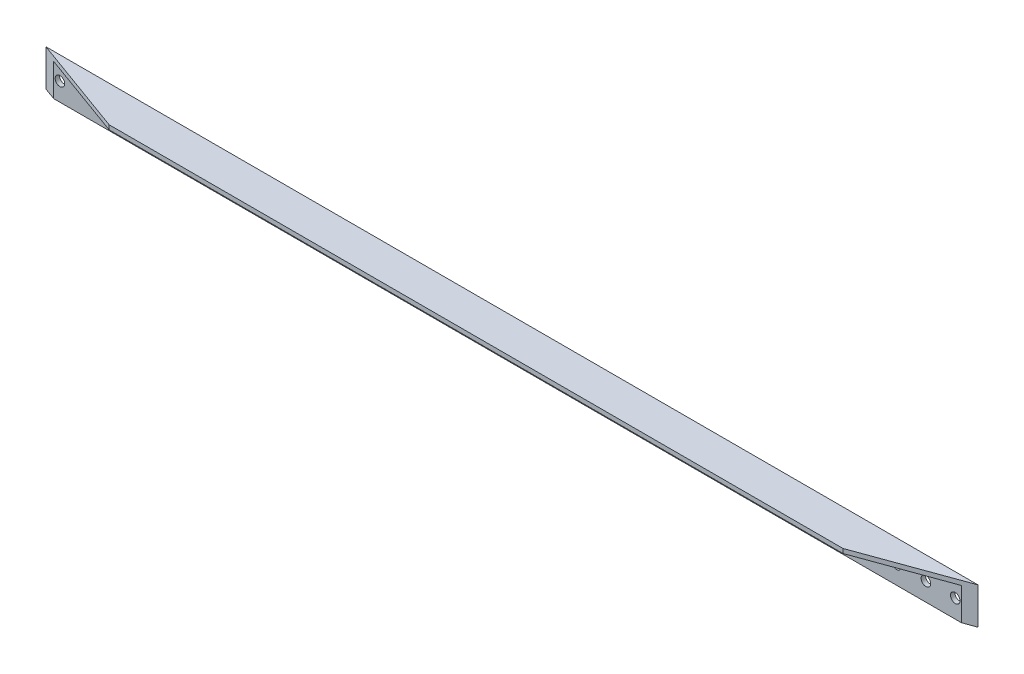
ISO-10303-21;
HEADER;
FILE_DESCRIPTION(('STEP AP214'),'2;1');
FILE_NAME('part.step','',(''),(''),'','','');
FILE_SCHEMA(('AUTOMOTIVE_DESIGN { 1 0 10303 214 1 1 1 1 }'));
ENDSEC;
DATA;
#1=APPLICATION_CONTEXT('core data for automotive mechanical design processes');
#2=APPLICATION_PROTOCOL_DEFINITION('international standard','automotive_design',2000,#1);
#3=PRODUCT_CONTEXT('',#1,'mechanical');
#4=PRODUCT('Part','Part','',(#3));
#5=PRODUCT_RELATED_PRODUCT_CATEGORY('part','',(#4));
#6=PRODUCT_DEFINITION_FORMATION('','',#4);
#7=PRODUCT_DEFINITION_CONTEXT('part definition',#1,'design');
#8=PRODUCT_DEFINITION('design','',#6,#7);
#9=PRODUCT_DEFINITION_SHAPE('','',#8);
#10=(LENGTH_UNIT() NAMED_UNIT(*) SI_UNIT(.MILLI.,.METRE.));
#11=(NAMED_UNIT(*) PLANE_ANGLE_UNIT() SI_UNIT($,.RADIAN.));
#12=(NAMED_UNIT(*) SI_UNIT($,.STERADIAN.) SOLID_ANGLE_UNIT());
#13=UNCERTAINTY_MEASURE_WITH_UNIT(LENGTH_MEASURE(1.E-05),#10,'distance_accuracy_value','');
#14=(GEOMETRIC_REPRESENTATION_CONTEXT(3) GLOBAL_UNCERTAINTY_ASSIGNED_CONTEXT((#13)) GLOBAL_UNIT_ASSIGNED_CONTEXT((#10,
#11,#12)) REPRESENTATION_CONTEXT('',''));
#15=CARTESIAN_POINT('',(0.,0.,0.));
#16=DIRECTION('',(0.,0.,1.));
#17=DIRECTION('',(1.,0.,0.));
#18=AXIS2_PLACEMENT_3D('',#15,#16,#17);
#19=CARTESIAN_POINT('',(-1270.,-50.,12.));
#20=DIRECTION('',(0.,0.,1.));
#21=DIRECTION('',(1.,0.,0.));
#22=AXIS2_PLACEMENT_3D('',#19,#20,#21);
#23=PLANE('',#22);
#24=DIRECTION('',(0.,1.,0.));
#25=VECTOR('',#24,1.);
#26=CARTESIAN_POINT('',(-1236.9387755102,-50.,12.));
#27=LINE('',#26,#25);
#28=CARTESIAN_POINT('',(-1236.9387755102,-50.,12.));
#29=VERTEX_POINT('',#28);
#30=CARTESIAN_POINT('',(-1236.9387755102,38.,12.));
#31=VERTEX_POINT('',#30);
#32=EDGE_CURVE('E239',#29,#31,#27,.T.);
#33=ORIENTED_EDGE('',*,*,#32,.F.);
#34=DIRECTION('',(1.,0.,0.));
#35=VECTOR('',#34,1.);
#36=CARTESIAN_POINT('',(-1270.,-50.,12.));
#37=LINE('',#36,#35);
#38=CARTESIAN_POINT('',(1236.9387755102,-50.,11.9999999999999));
#39=VERTEX_POINT('',#38);
#40=EDGE_CURVE('E103',#29,#39,#37,.T.);
#41=ORIENTED_EDGE('',*,*,#40,.T.);
#42=DIRECTION('',(0.,-1.,0.));
#43=VECTOR('',#42,1.);
#44=CARTESIAN_POINT('',(1236.9387755102,-50.,12.));
#45=LINE('',#44,#43);
#46=CARTESIAN_POINT('',(1236.9387755102,38.,12.));
#47=VERTEX_POINT('',#46);
#48=EDGE_CURVE('E230',#47,#39,#45,.T.);
#49=ORIENTED_EDGE('',*,*,#48,.F.);
#50=DIRECTION('',(1.,0.,0.));
#51=VECTOR('',#50,1.);
#52=CARTESIAN_POINT('',(-1270.,38.,12.));
#53=LINE('',#52,#51);
#54=EDGE_CURVE('E227',#31,#47,#53,.T.);
#55=ORIENTED_EDGE('',*,*,#54,.F.);
#56=EDGE_LOOP('',(#33,#41,#49,#55));
#57=FACE_BOUND('',#56,.T.);
#58=CARTESIAN_POINT('',(-1140.,0.,12.));
#59=DIRECTION('',(0.,0.,1.));
#60=DIRECTION('',(-1.,0.,0.));
#61=AXIS2_PLACEMENT_3D('',#58,#59,#60);
#62=CIRCLE('',#61,12.9999999999998);
#63=CARTESIAN_POINT('',(-1153.,0.,12.));
#64=VERTEX_POINT('',#63);
#65=EDGE_CURVE('E212',#64,#64,#62,.T.);
#66=ORIENTED_EDGE('',*,*,#65,.F.);
#67=EDGE_LOOP('',(#66));
#68=FACE_BOUND('',#67,.T.);
#69=CARTESIAN_POINT('',(-979.999999999999,0.,12.));
#70=DIRECTION('',(0.,0.,1.));
#71=DIRECTION('',(-1.,0.,0.));
#72=AXIS2_PLACEMENT_3D('',#69,#70,#71);
#73=CIRCLE('',#72,13.);
#74=CARTESIAN_POINT('',(-992.999999999999,0.,12.));
#75=VERTEX_POINT('',#74);
#76=EDGE_CURVE('E200',#75,#75,#73,.T.);
#77=ORIENTED_EDGE('',*,*,#76,.F.);
#78=EDGE_LOOP('',(#77));
#79=FACE_BOUND('',#78,.T.);
#80=CARTESIAN_POINT('',(-459.999999999999,0.,12.));
#81=DIRECTION('',(0.,0.,1.));
#82=DIRECTION('',(-1.,0.,0.));
#83=AXIS2_PLACEMENT_3D('',#80,#81,#82);
#84=CIRCLE('',#83,13.);
#85=CARTESIAN_POINT('',(-472.999999999999,0.,12.));
#86=VERTEX_POINT('',#85);
#87=EDGE_CURVE('E188',#86,#86,#84,.T.);
#88=ORIENTED_EDGE('',*,*,#87,.F.);
#89=EDGE_LOOP('',(#88));
#90=FACE_BOUND('',#89,.T.);
#91=CARTESIAN_POINT('',(-299.999999999999,0.,12.));
#92=DIRECTION('',(0.,0.,1.));
#93=DIRECTION('',(-1.,0.,0.));
#94=AXIS2_PLACEMENT_3D('',#91,#92,#93);
#95=CIRCLE('',#94,13.);
#96=CARTESIAN_POINT('',(-312.999999999999,0.,12.));
#97=VERTEX_POINT('',#96);
#98=EDGE_CURVE('E176',#97,#97,#95,.T.);
#99=ORIENTED_EDGE('',*,*,#98,.F.);
#100=EDGE_LOOP('',(#99));
#101=FACE_BOUND('',#100,.T.);
#102=CARTESIAN_POINT('',(179.999999999999,0.,12.));
#103=DIRECTION('',(0.,0.,1.));
#104=DIRECTION('',(1.,0.,0.));
#105=AXIS2_PLACEMENT_3D('',#102,#103,#104);
#106=CIRCLE('',#105,13.);
#107=CARTESIAN_POINT('',(192.999999999999,0.,12.));
#108=VERTEX_POINT('',#107);
#109=EDGE_CURVE('E164',#108,#108,#106,.T.);
#110=ORIENTED_EDGE('',*,*,#109,.F.);
#111=EDGE_LOOP('',(#110));
#112=FACE_BOUND('',#111,.T.);
#113=CARTESIAN_POINT('',(379.999999999999,0.,12.));
#114=DIRECTION('',(0.,0.,1.));
#115=DIRECTION('',(1.,0.,0.));
#116=AXIS2_PLACEMENT_3D('',#113,#114,#115);
#117=CIRCLE('',#116,13.);
#118=CARTESIAN_POINT('',(392.999999999999,0.,12.));
#119=VERTEX_POINT('',#118);
#120=EDGE_CURVE('E152',#119,#119,#117,.T.);
#121=ORIENTED_EDGE('',*,*,#120,.F.);
#122=EDGE_LOOP('',(#121));
#123=FACE_BOUND('',#122,.T.);
#124=CARTESIAN_POINT('',(579.999999999999,0.,12.));
#125=DIRECTION('',(0.,0.,1.));
#126=DIRECTION('',(1.,0.,0.));
#127=AXIS2_PLACEMENT_3D('',#124,#125,#126);
#128=CIRCLE('',#127,13.);
#129=CARTESIAN_POINT('',(592.999999999999,0.,12.));
#130=VERTEX_POINT('',#129);
#131=EDGE_CURVE('E140',#130,#130,#128,.T.);
#132=ORIENTED_EDGE('',*,*,#131,.F.);
#133=EDGE_LOOP('',(#132));
#134=FACE_BOUND('',#133,.T.);
#135=CARTESIAN_POINT('',(1060.,0.,12.));
#136=DIRECTION('',(0.,0.,1.));
#137=DIRECTION('',(1.,0.,0.));
#138=AXIS2_PLACEMENT_3D('',#135,#136,#137);
#139=CIRCLE('',#138,12.9999999999998);
#140=CARTESIAN_POINT('',(1073.,0.,12.));
#141=VERTEX_POINT('',#140);
#142=EDGE_CURVE('E128',#141,#141,#139,.T.);
#143=ORIENTED_EDGE('',*,*,#142,.F.);
#144=EDGE_LOOP('',(#143));
#145=FACE_BOUND('',#144,.T.);
#146=CARTESIAN_POINT('',(1220.,0.,12.));
#147=DIRECTION('',(0.,0.,1.));
#148=DIRECTION('',(1.,0.,0.));
#149=AXIS2_PLACEMENT_3D('',#146,#147,#148);
#150=CIRCLE('',#149,12.9999999999998);
#151=CARTESIAN_POINT('',(1233.,0.,12.));
#152=VERTEX_POINT('',#151);
#153=EDGE_CURVE('E96',#152,#152,#150,.T.);
#154=ORIENTED_EDGE('',*,*,#153,.F.);
#155=EDGE_LOOP('',(#154));
#156=FACE_BOUND('',#155,.T.);
#157=CARTESIAN_POINT('',(1140.,0.,12.));
#158=DIRECTION('',(0.,0.,1.));
#159=DIRECTION('',(1.,0.,0.));
#160=AXIS2_PLACEMENT_3D('',#157,#158,#159);
#161=CIRCLE('',#160,12.9999999999998);
#162=CARTESIAN_POINT('',(1153.,0.,12.));
#163=VERTEX_POINT('',#162);
#164=EDGE_CURVE('E122',#163,#163,#161,.T.);
#165=ORIENTED_EDGE('',*,*,#164,.F.);
#166=EDGE_LOOP('',(#165));
#167=FACE_BOUND('',#166,.T.);
#168=CARTESIAN_POINT('',(979.999999999999,0.,12.));
#169=DIRECTION('',(0.,0.,1.));
#170=DIRECTION('',(1.,0.,0.));
#171=AXIS2_PLACEMENT_3D('',#168,#169,#170);
#172=CIRCLE('',#171,13.);
#173=CARTESIAN_POINT('',(992.999999999999,0.,12.));
#174=VERTEX_POINT('',#173);
#175=EDGE_CURVE('E134',#174,#174,#172,.T.);
#176=ORIENTED_EDGE('',*,*,#175,.F.);
#177=EDGE_LOOP('',(#176));
#178=FACE_BOUND('',#177,.T.);
#179=CARTESIAN_POINT('',(459.999999999999,0.,12.));
#180=DIRECTION('',(0.,0.,1.));
#181=DIRECTION('',(1.,0.,0.));
#182=AXIS2_PLACEMENT_3D('',#179,#180,#181);
#183=CIRCLE('',#182,13.);
#184=CARTESIAN_POINT('',(472.999999999999,0.,12.));
#185=VERTEX_POINT('',#184);
#186=EDGE_CURVE('E146',#185,#185,#183,.T.);
#187=ORIENTED_EDGE('',*,*,#186,.F.);
#188=EDGE_LOOP('',(#187));
#189=FACE_BOUND('',#188,.T.);
#190=CARTESIAN_POINT('',(299.999999999999,0.,12.));
#191=DIRECTION('',(0.,0.,1.));
#192=DIRECTION('',(1.,0.,0.));
#193=AXIS2_PLACEMENT_3D('',#190,#191,#192);
#194=CIRCLE('',#193,13.);
#195=CARTESIAN_POINT('',(312.999999999999,0.,12.));
#196=VERTEX_POINT('',#195);
#197=EDGE_CURVE('E158',#196,#196,#194,.T.);
#198=ORIENTED_EDGE('',*,*,#197,.F.);
#199=EDGE_LOOP('',(#198));
#200=FACE_BOUND('',#199,.T.);
#201=CARTESIAN_POINT('',(-179.999999999999,0.,12.));
#202=DIRECTION('',(0.,0.,1.));
#203=DIRECTION('',(-1.,0.,0.));
#204=AXIS2_PLACEMENT_3D('',#201,#202,#203);
#205=CIRCLE('',#204,13.);
#206=CARTESIAN_POINT('',(-192.999999999999,0.,12.));
#207=VERTEX_POINT('',#206);
#208=EDGE_CURVE('E170',#207,#207,#205,.T.);
#209=ORIENTED_EDGE('',*,*,#208,.F.);
#210=EDGE_LOOP('',(#209));
#211=FACE_BOUND('',#210,.T.);
#212=CARTESIAN_POINT('',(-379.999999999999,0.,12.));
#213=DIRECTION('',(0.,0.,1.));
#214=DIRECTION('',(-1.,0.,0.));
#215=AXIS2_PLACEMENT_3D('',#212,#213,#214);
#216=CIRCLE('',#215,13.);
#217=CARTESIAN_POINT('',(-392.999999999999,0.,12.));
#218=VERTEX_POINT('',#217);
#219=EDGE_CURVE('E182',#218,#218,#216,.T.);
#220=ORIENTED_EDGE('',*,*,#219,.F.);
#221=EDGE_LOOP('',(#220));
#222=FACE_BOUND('',#221,.T.);
#223=CARTESIAN_POINT('',(-579.999999999999,0.,12.));
#224=DIRECTION('',(0.,0.,1.));
#225=DIRECTION('',(-1.,0.,0.));
#226=AXIS2_PLACEMENT_3D('',#223,#224,#225);
#227=CIRCLE('',#226,13.);
#228=CARTESIAN_POINT('',(-592.999999999999,0.,12.));
#229=VERTEX_POINT('',#228);
#230=EDGE_CURVE('E194',#229,#229,#227,.T.);
#231=ORIENTED_EDGE('',*,*,#230,.F.);
#232=EDGE_LOOP('',(#231));
#233=FACE_BOUND('',#232,.T.);
#234=CARTESIAN_POINT('',(-1060.,0.,12.));
#235=DIRECTION('',(0.,0.,1.));
#236=DIRECTION('',(-1.,0.,0.));
#237=AXIS2_PLACEMENT_3D('',#234,#235,#236);
#238=CIRCLE('',#237,12.9999999999998);
#239=CARTESIAN_POINT('',(-1073.,0.,12.));
#240=VERTEX_POINT('',#239);
#241=EDGE_CURVE('E206',#240,#240,#238,.T.);
#242=ORIENTED_EDGE('',*,*,#241,.F.);
#243=EDGE_LOOP('',(#242));
#244=FACE_BOUND('',#243,.T.);
#245=CARTESIAN_POINT('',(-1220.,0.,12.));
#246=DIRECTION('',(0.,0.,1.));
#247=DIRECTION('',(-1.,0.,0.));
#248=AXIS2_PLACEMENT_3D('',#245,#246,#247);
#249=CIRCLE('',#248,12.9999999999998);
#250=CARTESIAN_POINT('',(-1233.,0.,12.));
#251=VERTEX_POINT('',#250);
#252=EDGE_CURVE('E218',#251,#251,#249,.T.);
#253=ORIENTED_EDGE('',*,*,#252,.F.);
#254=EDGE_LOOP('',(#253));
#255=FACE_BOUND('',#254,.T.);
#256=ADVANCED_FACE('F33',(#57,#68,#79,#90,#101,#112,#123,#134,#145,#156,#167,#178,#189,#200,
#211,#222,#233,#244,#255),#23,.T.);
#257=CARTESIAN_POINT('',(-1270.,-50.,0.));
#258=DIRECTION('',(0.,0.,1.));
#259=DIRECTION('',(1.,0.,0.));
#260=AXIS2_PLACEMENT_3D('',#257,#258,#259);
#261=PLANE('',#260);
#262=DIRECTION('',(0.,-1.,0.));
#263=VECTOR('',#262,1.);
#264=CARTESIAN_POINT('',(-1270.,50.,0.));
#265=LINE('',#264,#263);
#266=CARTESIAN_POINT('',(-1270.,50.,0.));
#267=VERTEX_POINT('',#266);
#268=CARTESIAN_POINT('',(-1270.,-50.,0.));
#269=VERTEX_POINT('',#268);
#270=EDGE_CURVE('E84',#267,#269,#265,.T.);
#271=ORIENTED_EDGE('',*,*,#270,.F.);
#272=DIRECTION('',(-1.,0.,0.));
#273=VECTOR('',#272,1.);
#274=CARTESIAN_POINT('',(-1270.,50.,0.));
#275=LINE('',#274,#273);
#276=CARTESIAN_POINT('',(1270.,50.,0.));
#277=VERTEX_POINT('',#276);
#278=EDGE_CURVE('E109',#277,#267,#275,.T.);
#279=ORIENTED_EDGE('',*,*,#278,.F.);
#280=DIRECTION('',(0.,1.,0.));
#281=VECTOR('',#280,1.);
#282=CARTESIAN_POINT('',(1270.,50.,0.));
#283=LINE('',#282,#281);
#284=CARTESIAN_POINT('',(1270.,-50.,0.));
#285=VERTEX_POINT('',#284);
#286=EDGE_CURVE('E107',#285,#277,#283,.T.);
#287=ORIENTED_EDGE('',*,*,#286,.F.);
#288=DIRECTION('',(1.,0.,0.));
#289=VECTOR('',#288,1.);
#290=CARTESIAN_POINT('',(-1270.,-50.,0.));
#291=LINE('',#290,#289);
#292=EDGE_CURVE('E95',#269,#285,#291,.T.);
#293=ORIENTED_EDGE('',*,*,#292,.F.);
#294=EDGE_LOOP('',(#271,#279,#287,#293));
#295=FACE_BOUND('',#294,.T.);
#296=CARTESIAN_POINT('',(1220.,0.,0.));
#297=DIRECTION('',(0.,0.,1.));
#298=DIRECTION('',(1.,0.,0.));
#299=AXIS2_PLACEMENT_3D('',#296,#297,#298);
#300=CIRCLE('',#299,12.9999999999998);
#301=CARTESIAN_POINT('',(1233.,0.,0.));
#302=VERTEX_POINT('',#301);
#303=EDGE_CURVE('E119',#302,#302,#300,.T.);
#304=ORIENTED_EDGE('',*,*,#303,.T.);
#305=EDGE_LOOP('',(#304));
#306=FACE_BOUND('',#305,.T.);
#307=CARTESIAN_POINT('',(1140.,0.,0.));
#308=DIRECTION('',(0.,0.,1.));
#309=DIRECTION('',(1.,0.,0.));
#310=AXIS2_PLACEMENT_3D('',#307,#308,#309);
#311=CIRCLE('',#310,12.9999999999998);
#312=CARTESIAN_POINT('',(1153.,0.,0.));
#313=VERTEX_POINT('',#312);
#314=EDGE_CURVE('E125',#313,#313,#311,.T.);
#315=ORIENTED_EDGE('',*,*,#314,.T.);
#316=EDGE_LOOP('',(#315));
#317=FACE_BOUND('',#316,.T.);
#318=CARTESIAN_POINT('',(1060.,0.,0.));
#319=DIRECTION('',(0.,0.,1.));
#320=DIRECTION('',(1.,0.,0.));
#321=AXIS2_PLACEMENT_3D('',#318,#319,#320);
#322=CIRCLE('',#321,12.9999999999998);
#323=CARTESIAN_POINT('',(1073.,0.,0.));
#324=VERTEX_POINT('',#323);
#325=EDGE_CURVE('E131',#324,#324,#322,.T.);
#326=ORIENTED_EDGE('',*,*,#325,.T.);
#327=EDGE_LOOP('',(#326));
#328=FACE_BOUND('',#327,.T.);
#329=CARTESIAN_POINT('',(979.999999999999,0.,0.));
#330=DIRECTION('',(0.,0.,1.));
#331=DIRECTION('',(1.,0.,0.));
#332=AXIS2_PLACEMENT_3D('',#329,#330,#331);
#333=CIRCLE('',#332,13.);
#334=CARTESIAN_POINT('',(992.999999999999,0.,0.));
#335=VERTEX_POINT('',#334);
#336=EDGE_CURVE('E137',#335,#335,#333,.T.);
#337=ORIENTED_EDGE('',*,*,#336,.T.);
#338=EDGE_LOOP('',(#337));
#339=FACE_BOUND('',#338,.T.);
#340=CARTESIAN_POINT('',(579.999999999999,0.,0.));
#341=DIRECTION('',(0.,0.,1.));
#342=DIRECTION('',(1.,0.,0.));
#343=AXIS2_PLACEMENT_3D('',#340,#341,#342);
#344=CIRCLE('',#343,13.);
#345=CARTESIAN_POINT('',(592.999999999999,0.,0.));
#346=VERTEX_POINT('',#345);
#347=EDGE_CURVE('E143',#346,#346,#344,.T.);
#348=ORIENTED_EDGE('',*,*,#347,.T.);
#349=EDGE_LOOP('',(#348));
#350=FACE_BOUND('',#349,.T.);
#351=CARTESIAN_POINT('',(459.999999999999,0.,0.));
#352=DIRECTION('',(0.,0.,1.));
#353=DIRECTION('',(1.,0.,0.));
#354=AXIS2_PLACEMENT_3D('',#351,#352,#353);
#355=CIRCLE('',#354,13.);
#356=CARTESIAN_POINT('',(472.999999999999,0.,0.));
#357=VERTEX_POINT('',#356);
#358=EDGE_CURVE('E149',#357,#357,#355,.T.);
#359=ORIENTED_EDGE('',*,*,#358,.T.);
#360=EDGE_LOOP('',(#359));
#361=FACE_BOUND('',#360,.T.);
#362=CARTESIAN_POINT('',(379.999999999999,0.,0.));
#363=DIRECTION('',(0.,0.,1.));
#364=DIRECTION('',(1.,0.,0.));
#365=AXIS2_PLACEMENT_3D('',#362,#363,#364);
#366=CIRCLE('',#365,13.);
#367=CARTESIAN_POINT('',(392.999999999999,0.,0.));
#368=VERTEX_POINT('',#367);
#369=EDGE_CURVE('E155',#368,#368,#366,.T.);
#370=ORIENTED_EDGE('',*,*,#369,.T.);
#371=EDGE_LOOP('',(#370));
#372=FACE_BOUND('',#371,.T.);
#373=CARTESIAN_POINT('',(299.999999999999,0.,0.));
#374=DIRECTION('',(0.,0.,1.));
#375=DIRECTION('',(1.,0.,0.));
#376=AXIS2_PLACEMENT_3D('',#373,#374,#375);
#377=CIRCLE('',#376,13.);
#378=CARTESIAN_POINT('',(312.999999999999,0.,0.));
#379=VERTEX_POINT('',#378);
#380=EDGE_CURVE('E161',#379,#379,#377,.T.);
#381=ORIENTED_EDGE('',*,*,#380,.T.);
#382=EDGE_LOOP('',(#381));
#383=FACE_BOUND('',#382,.T.);
#384=CARTESIAN_POINT('',(179.999999999999,0.,0.));
#385=DIRECTION('',(0.,0.,1.));
#386=DIRECTION('',(1.,0.,0.));
#387=AXIS2_PLACEMENT_3D('',#384,#385,#386);
#388=CIRCLE('',#387,13.);
#389=CARTESIAN_POINT('',(192.999999999999,0.,0.));
#390=VERTEX_POINT('',#389);
#391=EDGE_CURVE('E167',#390,#390,#388,.T.);
#392=ORIENTED_EDGE('',*,*,#391,.T.);
#393=EDGE_LOOP('',(#392));
#394=FACE_BOUND('',#393,.T.);
#395=CARTESIAN_POINT('',(-179.999999999999,0.,0.));
#396=DIRECTION('',(0.,0.,1.));
#397=DIRECTION('',(-1.,0.,0.));
#398=AXIS2_PLACEMENT_3D('',#395,#396,#397);
#399=CIRCLE('',#398,13.);
#400=CARTESIAN_POINT('',(-192.999999999999,0.,0.));
#401=VERTEX_POINT('',#400);
#402=EDGE_CURVE('E173',#401,#401,#399,.T.);
#403=ORIENTED_EDGE('',*,*,#402,.T.);
#404=EDGE_LOOP('',(#403));
#405=FACE_BOUND('',#404,.T.);
#406=CARTESIAN_POINT('',(-299.999999999999,0.,0.));
#407=DIRECTION('',(0.,0.,1.));
#408=DIRECTION('',(-1.,0.,0.));
#409=AXIS2_PLACEMENT_3D('',#406,#407,#408);
#410=CIRCLE('',#409,13.);
#411=CARTESIAN_POINT('',(-312.999999999999,0.,0.));
#412=VERTEX_POINT('',#411);
#413=EDGE_CURVE('E179',#412,#412,#410,.T.);
#414=ORIENTED_EDGE('',*,*,#413,.T.);
#415=EDGE_LOOP('',(#414));
#416=FACE_BOUND('',#415,.T.);
#417=CARTESIAN_POINT('',(-379.999999999999,0.,0.));
#418=DIRECTION('',(0.,0.,1.));
#419=DIRECTION('',(-1.,0.,0.));
#420=AXIS2_PLACEMENT_3D('',#417,#418,#419);
#421=CIRCLE('',#420,13.);
#422=CARTESIAN_POINT('',(-392.999999999999,0.,0.));
#423=VERTEX_POINT('',#422);
#424=EDGE_CURVE('E185',#423,#423,#421,.T.);
#425=ORIENTED_EDGE('',*,*,#424,.T.);
#426=EDGE_LOOP('',(#425));
#427=FACE_BOUND('',#426,.T.);
#428=CARTESIAN_POINT('',(-459.999999999999,0.,0.));
#429=DIRECTION('',(0.,0.,1.));
#430=DIRECTION('',(-1.,0.,0.));
#431=AXIS2_PLACEMENT_3D('',#428,#429,#430);
#432=CIRCLE('',#431,13.);
#433=CARTESIAN_POINT('',(-472.999999999999,0.,0.));
#434=VERTEX_POINT('',#433);
#435=EDGE_CURVE('E191',#434,#434,#432,.T.);
#436=ORIENTED_EDGE('',*,*,#435,.T.);
#437=EDGE_LOOP('',(#436));
#438=FACE_BOUND('',#437,.T.);
#439=CARTESIAN_POINT('',(-579.999999999999,0.,0.));
#440=DIRECTION('',(0.,0.,1.));
#441=DIRECTION('',(-1.,0.,0.));
#442=AXIS2_PLACEMENT_3D('',#439,#440,#441);
#443=CIRCLE('',#442,13.);
#444=CARTESIAN_POINT('',(-592.999999999999,0.,0.));
#445=VERTEX_POINT('',#444);
#446=EDGE_CURVE('E197',#445,#445,#443,.T.);
#447=ORIENTED_EDGE('',*,*,#446,.T.);
#448=EDGE_LOOP('',(#447));
#449=FACE_BOUND('',#448,.T.);
#450=CARTESIAN_POINT('',(-979.999999999999,0.,0.));
#451=DIRECTION('',(0.,0.,1.));
#452=DIRECTION('',(-1.,0.,0.));
#453=AXIS2_PLACEMENT_3D('',#450,#451,#452);
#454=CIRCLE('',#453,13.);
#455=CARTESIAN_POINT('',(-992.999999999999,0.,0.));
#456=VERTEX_POINT('',#455);
#457=EDGE_CURVE('E203',#456,#456,#454,.T.);
#458=ORIENTED_EDGE('',*,*,#457,.T.);
#459=EDGE_LOOP('',(#458));
#460=FACE_BOUND('',#459,.T.);
#461=CARTESIAN_POINT('',(-1060.,0.,0.));
#462=DIRECTION('',(0.,0.,1.));
#463=DIRECTION('',(-1.,0.,0.));
#464=AXIS2_PLACEMENT_3D('',#461,#462,#463);
#465=CIRCLE('',#464,12.9999999999998);
#466=CARTESIAN_POINT('',(-1073.,0.,0.));
#467=VERTEX_POINT('',#466);
#468=EDGE_CURVE('E209',#467,#467,#465,.T.);
#469=ORIENTED_EDGE('',*,*,#468,.T.);
#470=EDGE_LOOP('',(#469));
#471=FACE_BOUND('',#470,.T.);
#472=CARTESIAN_POINT('',(-1140.,0.,0.));
#473=DIRECTION('',(0.,0.,1.));
#474=DIRECTION('',(-1.,0.,0.));
#475=AXIS2_PLACEMENT_3D('',#472,#473,#474);
#476=CIRCLE('',#475,12.9999999999998);
#477=CARTESIAN_POINT('',(-1153.,0.,0.));
#478=VERTEX_POINT('',#477);
#479=EDGE_CURVE('E215',#478,#478,#476,.T.);
#480=ORIENTED_EDGE('',*,*,#479,.T.);
#481=EDGE_LOOP('',(#480));
#482=FACE_BOUND('',#481,.T.);
#483=CARTESIAN_POINT('',(-1220.,0.,0.));
#484=DIRECTION('',(0.,0.,1.));
#485=DIRECTION('',(-1.,0.,0.));
#486=AXIS2_PLACEMENT_3D('',#483,#484,#485);
#487=CIRCLE('',#486,12.9999999999998);
#488=CARTESIAN_POINT('',(-1233.,0.,0.));
#489=VERTEX_POINT('',#488);
#490=EDGE_CURVE('E221',#489,#489,#487,.T.);
#491=ORIENTED_EDGE('',*,*,#490,.T.);
#492=EDGE_LOOP('',(#491));
#493=FACE_BOUND('',#492,.T.);
#494=ADVANCED_FACE('F105',(#295,#306,#317,#328,#339,#350,#361,#372,#383,#394,#405,#416,#427,
#438,#449,#460,#471,#482,#493),#261,.F.);
#495=CARTESIAN_POINT('',(-1270.,-50.,12.));
#496=DIRECTION('',(0.,1.,0.));
#497=DIRECTION('',(0.,0.,1.));
#498=AXIS2_PLACEMENT_3D('',#495,#496,#497);
#499=PLANE('',#498);
#500=ORIENTED_EDGE('',*,*,#40,.F.);
#501=DIRECTION('',(-0.939996554641713,0.,-0.341183934647733));
#502=VECTOR('',#501,1.);
#503=CARTESIAN_POINT('',(-1270.,-50.,0.));
#504=LINE('',#503,#502);
#505=EDGE_CURVE('E87',#29,#269,#504,.T.);
#506=ORIENTED_EDGE('',*,*,#505,.T.);
#507=ORIENTED_EDGE('',*,*,#292,.T.);
#508=DIRECTION('',(-0.939996554641713,0.,0.341183934647733));
#509=VECTOR('',#508,1.);
#510=CARTESIAN_POINT('',(1270.,-50.,0.));
#511=LINE('',#510,#509);
#512=EDGE_CURVE('E237',#285,#39,#511,.T.);
#513=ORIENTED_EDGE('',*,*,#512,.T.);
#514=EDGE_LOOP('',(#500,#506,#507,#513));
#515=FACE_BOUND('',#514,.T.);
#516=ADVANCED_FACE('F35',(#515),#499,.F.);
#517=CARTESIAN_POINT('',(-1270.,50.,12.));
#518=DIRECTION('',(0.,-1.,0.));
#519=DIRECTION('',(0.,0.,-1.));
#520=AXIS2_PLACEMENT_3D('',#517,#518,#519);
#521=PLANE('',#520);
#522=ORIENTED_EDGE('',*,*,#278,.T.);
#523=DIRECTION('',(-0.939996554641713,0.,-0.341183934647733));
#524=VECTOR('',#523,1.);
#525=CARTESIAN_POINT('',(-1270.,50.,0.));
#526=LINE('',#525,#524);
#527=CARTESIAN_POINT('',(-1000.,50.,98.));
#528=VERTEX_POINT('',#527);
#529=EDGE_CURVE('E90',#528,#267,#526,.T.);
#530=ORIENTED_EDGE('',*,*,#529,.F.);
#531=DIRECTION('',(-1.,0.,0.));
#532=VECTOR('',#531,1.);
#533=CARTESIAN_POINT('',(-1270.,50.,98.));
#534=LINE('',#533,#532);
#535=CARTESIAN_POINT('',(999.999999999999,50.,98.));
#536=VERTEX_POINT('',#535);
#537=EDGE_CURVE('E224',#536,#528,#534,.T.);
#538=ORIENTED_EDGE('',*,*,#537,.F.);
#539=DIRECTION('',(-0.939996554641713,0.,0.341183934647733));
#540=VECTOR('',#539,1.);
#541=CARTESIAN_POINT('',(1270.,50.,0.));
#542=LINE('',#541,#540);
#543=EDGE_CURVE('E55',#277,#536,#542,.T.);
#544=ORIENTED_EDGE('',*,*,#543,.F.);
#545=EDGE_LOOP('',(#522,#530,#538,#544));
#546=FACE_BOUND('',#545,.T.);
#547=ADVANCED_FACE('F251',(#546),#521,.F.);
#548=CARTESIAN_POINT('',(1220.,0.,12.));
#549=DIRECTION('',(0.,0.,-1.));
#550=DIRECTION('',(-1.,0.,0.));
#551=AXIS2_PLACEMENT_3D('',#548,#549,#550);
#552=CYLINDRICAL_SURFACE('',#551,12.9999999999998);
#553=ORIENTED_EDGE('',*,*,#153,.T.);
#554=EDGE_LOOP('',(#553));
#555=FACE_BOUND('',#554,.T.);
#556=ORIENTED_EDGE('',*,*,#303,.F.);
#557=EDGE_LOOP('',(#556));
#558=FACE_BOUND('',#557,.T.);
#559=ADVANCED_FACE('F270',(#555,#558),#552,.F.);
#560=CARTESIAN_POINT('',(1140.,0.,12.));
#561=DIRECTION('',(0.,0.,-1.));
#562=DIRECTION('',(-1.,0.,0.));
#563=AXIS2_PLACEMENT_3D('',#560,#561,#562);
#564=CYLINDRICAL_SURFACE('',#563,12.9999999999998);
#565=ORIENTED_EDGE('',*,*,#164,.T.);
#566=EDGE_LOOP('',(#565));
#567=FACE_BOUND('',#566,.T.);
#568=ORIENTED_EDGE('',*,*,#314,.F.);
#569=EDGE_LOOP('',(#568));
#570=FACE_BOUND('',#569,.T.);
#571=ADVANCED_FACE('F277',(#567,#570),#564,.F.);
#572=CARTESIAN_POINT('',(1060.,0.,12.));
#573=DIRECTION('',(0.,0.,-1.));
#574=DIRECTION('',(-1.,0.,0.));
#575=AXIS2_PLACEMENT_3D('',#572,#573,#574);
#576=CYLINDRICAL_SURFACE('',#575,12.9999999999998);
#577=ORIENTED_EDGE('',*,*,#142,.T.);
#578=EDGE_LOOP('',(#577));
#579=FACE_BOUND('',#578,.T.);
#580=ORIENTED_EDGE('',*,*,#325,.F.);
#581=EDGE_LOOP('',(#580));
#582=FACE_BOUND('',#581,.T.);
#583=ADVANCED_FACE('F439',(#579,#582),#576,.F.);
#584=CARTESIAN_POINT('',(979.999999999999,0.,12.));
#585=DIRECTION('',(0.,0.,-1.));
#586=DIRECTION('',(-1.,0.,0.));
#587=AXIS2_PLACEMENT_3D('',#584,#585,#586);
#588=CYLINDRICAL_SURFACE('',#587,13.);
#589=ORIENTED_EDGE('',*,*,#175,.T.);
#590=EDGE_LOOP('',(#589));
#591=FACE_BOUND('',#590,.T.);
#592=ORIENTED_EDGE('',*,*,#336,.F.);
#593=EDGE_LOOP('',(#592));
#594=FACE_BOUND('',#593,.T.);
#595=ADVANCED_FACE('F429',(#591,#594),#588,.F.);
#596=CARTESIAN_POINT('',(579.999999999999,0.,12.));
#597=DIRECTION('',(0.,0.,-1.));
#598=DIRECTION('',(-1.,0.,0.));
#599=AXIS2_PLACEMENT_3D('',#596,#597,#598);
#600=CYLINDRICAL_SURFACE('',#599,13.);
#601=ORIENTED_EDGE('',*,*,#131,.T.);
#602=EDGE_LOOP('',(#601));
#603=FACE_BOUND('',#602,.T.);
#604=ORIENTED_EDGE('',*,*,#347,.F.);
#605=EDGE_LOOP('',(#604));
#606=FACE_BOUND('',#605,.T.);
#607=ADVANCED_FACE('F419',(#603,#606),#600,.F.);
#608=CARTESIAN_POINT('',(459.999999999999,0.,12.));
#609=DIRECTION('',(0.,0.,-1.));
#610=DIRECTION('',(-1.,0.,0.));
#611=AXIS2_PLACEMENT_3D('',#608,#609,#610);
#612=CYLINDRICAL_SURFACE('',#611,13.);
#613=ORIENTED_EDGE('',*,*,#186,.T.);
#614=EDGE_LOOP('',(#613));
#615=FACE_BOUND('',#614,.T.);
#616=ORIENTED_EDGE('',*,*,#358,.F.);
#617=EDGE_LOOP('',(#616));
#618=FACE_BOUND('',#617,.T.);
#619=ADVANCED_FACE('F409',(#615,#618),#612,.F.);
#620=CARTESIAN_POINT('',(379.999999999999,0.,12.));
#621=DIRECTION('',(0.,0.,-1.));
#622=DIRECTION('',(-1.,0.,0.));
#623=AXIS2_PLACEMENT_3D('',#620,#621,#622);
#624=CYLINDRICAL_SURFACE('',#623,13.);
#625=ORIENTED_EDGE('',*,*,#120,.T.);
#626=EDGE_LOOP('',(#625));
#627=FACE_BOUND('',#626,.T.);
#628=ORIENTED_EDGE('',*,*,#369,.F.);
#629=EDGE_LOOP('',(#628));
#630=FACE_BOUND('',#629,.T.);
#631=ADVANCED_FACE('F399',(#627,#630),#624,.F.);
#632=CARTESIAN_POINT('',(299.999999999999,0.,12.));
#633=DIRECTION('',(0.,0.,-1.));
#634=DIRECTION('',(-1.,0.,0.));
#635=AXIS2_PLACEMENT_3D('',#632,#633,#634);
#636=CYLINDRICAL_SURFACE('',#635,13.);
#637=ORIENTED_EDGE('',*,*,#197,.T.);
#638=EDGE_LOOP('',(#637));
#639=FACE_BOUND('',#638,.T.);
#640=ORIENTED_EDGE('',*,*,#380,.F.);
#641=EDGE_LOOP('',(#640));
#642=FACE_BOUND('',#641,.T.);
#643=ADVANCED_FACE('F389',(#639,#642),#636,.F.);
#644=CARTESIAN_POINT('',(179.999999999999,0.,12.));
#645=DIRECTION('',(0.,0.,-1.));
#646=DIRECTION('',(-1.,0.,0.));
#647=AXIS2_PLACEMENT_3D('',#644,#645,#646);
#648=CYLINDRICAL_SURFACE('',#647,13.);
#649=ORIENTED_EDGE('',*,*,#109,.T.);
#650=EDGE_LOOP('',(#649));
#651=FACE_BOUND('',#650,.T.);
#652=ORIENTED_EDGE('',*,*,#391,.F.);
#653=EDGE_LOOP('',(#652));
#654=FACE_BOUND('',#653,.T.);
#655=ADVANCED_FACE('F379',(#651,#654),#648,.F.);
#656=CARTESIAN_POINT('',(-179.999999999999,0.,12.));
#657=DIRECTION('',(0.,0.,-1.));
#658=DIRECTION('',(-1.,0.,0.));
#659=AXIS2_PLACEMENT_3D('',#656,#657,#658);
#660=CYLINDRICAL_SURFACE('',#659,13.);
#661=ORIENTED_EDGE('',*,*,#208,.T.);
#662=EDGE_LOOP('',(#661));
#663=FACE_BOUND('',#662,.T.);
#664=ORIENTED_EDGE('',*,*,#402,.F.);
#665=EDGE_LOOP('',(#664));
#666=FACE_BOUND('',#665,.T.);
#667=ADVANCED_FACE('F369',(#663,#666),#660,.F.);
#668=CARTESIAN_POINT('',(-299.999999999999,0.,12.));
#669=DIRECTION('',(0.,0.,-1.));
#670=DIRECTION('',(-1.,0.,0.));
#671=AXIS2_PLACEMENT_3D('',#668,#669,#670);
#672=CYLINDRICAL_SURFACE('',#671,13.);
#673=ORIENTED_EDGE('',*,*,#98,.T.);
#674=EDGE_LOOP('',(#673));
#675=FACE_BOUND('',#674,.T.);
#676=ORIENTED_EDGE('',*,*,#413,.F.);
#677=EDGE_LOOP('',(#676));
#678=FACE_BOUND('',#677,.T.);
#679=ADVANCED_FACE('F359',(#675,#678),#672,.F.);
#680=CARTESIAN_POINT('',(-379.999999999999,0.,12.));
#681=DIRECTION('',(0.,0.,-1.));
#682=DIRECTION('',(-1.,0.,0.));
#683=AXIS2_PLACEMENT_3D('',#680,#681,#682);
#684=CYLINDRICAL_SURFACE('',#683,13.);
#685=ORIENTED_EDGE('',*,*,#219,.T.);
#686=EDGE_LOOP('',(#685));
#687=FACE_BOUND('',#686,.T.);
#688=ORIENTED_EDGE('',*,*,#424,.F.);
#689=EDGE_LOOP('',(#688));
#690=FACE_BOUND('',#689,.T.);
#691=ADVANCED_FACE('F349',(#687,#690),#684,.F.);
#692=CARTESIAN_POINT('',(-459.999999999999,0.,12.));
#693=DIRECTION('',(0.,0.,-1.));
#694=DIRECTION('',(-1.,0.,0.));
#695=AXIS2_PLACEMENT_3D('',#692,#693,#694);
#696=CYLINDRICAL_SURFACE('',#695,13.);
#697=ORIENTED_EDGE('',*,*,#87,.T.);
#698=EDGE_LOOP('',(#697));
#699=FACE_BOUND('',#698,.T.);
#700=ORIENTED_EDGE('',*,*,#435,.F.);
#701=EDGE_LOOP('',(#700));
#702=FACE_BOUND('',#701,.T.);
#703=ADVANCED_FACE('F339',(#699,#702),#696,.F.);
#704=CARTESIAN_POINT('',(-579.999999999999,0.,12.));
#705=DIRECTION('',(0.,0.,-1.));
#706=DIRECTION('',(-1.,0.,0.));
#707=AXIS2_PLACEMENT_3D('',#704,#705,#706);
#708=CYLINDRICAL_SURFACE('',#707,13.);
#709=ORIENTED_EDGE('',*,*,#230,.T.);
#710=EDGE_LOOP('',(#709));
#711=FACE_BOUND('',#710,.T.);
#712=ORIENTED_EDGE('',*,*,#446,.F.);
#713=EDGE_LOOP('',(#712));
#714=FACE_BOUND('',#713,.T.);
#715=ADVANCED_FACE('F329',(#711,#714),#708,.F.);
#716=CARTESIAN_POINT('',(-979.999999999999,0.,12.));
#717=DIRECTION('',(0.,0.,-1.));
#718=DIRECTION('',(-1.,0.,0.));
#719=AXIS2_PLACEMENT_3D('',#716,#717,#718);
#720=CYLINDRICAL_SURFACE('',#719,13.);
#721=ORIENTED_EDGE('',*,*,#76,.T.);
#722=EDGE_LOOP('',(#721));
#723=FACE_BOUND('',#722,.T.);
#724=ORIENTED_EDGE('',*,*,#457,.F.);
#725=EDGE_LOOP('',(#724));
#726=FACE_BOUND('',#725,.T.);
#727=ADVANCED_FACE('F319',(#723,#726),#720,.F.);
#728=CARTESIAN_POINT('',(-1060.,0.,12.));
#729=DIRECTION('',(0.,0.,-1.));
#730=DIRECTION('',(-1.,0.,0.));
#731=AXIS2_PLACEMENT_3D('',#728,#729,#730);
#732=CYLINDRICAL_SURFACE('',#731,12.9999999999998);
#733=ORIENTED_EDGE('',*,*,#241,.T.);
#734=EDGE_LOOP('',(#733));
#735=FACE_BOUND('',#734,.T.);
#736=ORIENTED_EDGE('',*,*,#468,.F.);
#737=EDGE_LOOP('',(#736));
#738=FACE_BOUND('',#737,.T.);
#739=ADVANCED_FACE('F309',(#735,#738),#732,.F.);
#740=CARTESIAN_POINT('',(-1140.,0.,12.));
#741=DIRECTION('',(0.,0.,-1.));
#742=DIRECTION('',(-1.,0.,0.));
#743=AXIS2_PLACEMENT_3D('',#740,#741,#742);
#744=CYLINDRICAL_SURFACE('',#743,12.9999999999998);
#745=ORIENTED_EDGE('',*,*,#65,.T.);
#746=EDGE_LOOP('',(#745));
#747=FACE_BOUND('',#746,.T.);
#748=ORIENTED_EDGE('',*,*,#479,.F.);
#749=EDGE_LOOP('',(#748));
#750=FACE_BOUND('',#749,.T.);
#751=ADVANCED_FACE('F298',(#747,#750),#744,.F.);
#752=CARTESIAN_POINT('',(-1220.,0.,12.));
#753=DIRECTION('',(0.,0.,-1.));
#754=DIRECTION('',(-1.,0.,0.));
#755=AXIS2_PLACEMENT_3D('',#752,#753,#754);
#756=CYLINDRICAL_SURFACE('',#755,12.9999999999998);
#757=ORIENTED_EDGE('',*,*,#252,.T.);
#758=EDGE_LOOP('',(#757));
#759=FACE_BOUND('',#758,.T.);
#760=ORIENTED_EDGE('',*,*,#490,.F.);
#761=EDGE_LOOP('',(#760));
#762=FACE_BOUND('',#761,.T.);
#763=ADVANCED_FACE('F261',(#759,#762),#756,.F.);
#764=CARTESIAN_POINT('',(-1270.,38.,98.));
#765=DIRECTION('',(0.,1.,0.));
#766=DIRECTION('',(0.,0.,1.));
#767=AXIS2_PLACEMENT_3D('',#764,#765,#766);
#768=PLANE('',#767);
#769=DIRECTION('',(1.,0.,0.));
#770=VECTOR('',#769,1.);
#771=CARTESIAN_POINT('',(-1270.,38.,98.));
#772=LINE('',#771,#770);
#773=CARTESIAN_POINT('',(-1000.,38.,98.));
#774=VERTEX_POINT('',#773);
#775=CARTESIAN_POINT('',(1000.,38.,98.));
#776=VERTEX_POINT('',#775);
#777=EDGE_CURVE('E229',#774,#776,#772,.T.);
#778=ORIENTED_EDGE('',*,*,#777,.F.);
#779=DIRECTION('',(-0.939996554641713,0.,-0.341183934647733));
#780=VECTOR('',#779,1.);
#781=CARTESIAN_POINT('',(-1238.57025113934,38.,11.4078347716475));
#782=LINE('',#781,#780);
#783=EDGE_CURVE('E47',#774,#31,#782,.T.);
#784=ORIENTED_EDGE('',*,*,#783,.T.);
#785=ORIENTED_EDGE('',*,*,#54,.T.);
#786=DIRECTION('',(-0.939996554641713,0.,0.341183934647733));
#787=VECTOR('',#786,1.);
#788=CARTESIAN_POINT('',(-1005.75729661592,38.,826.015611364297));
#789=LINE('',#788,#787);
#790=EDGE_CURVE('E235',#47,#776,#789,.T.);
#791=ORIENTED_EDGE('',*,*,#790,.T.);
#792=EDGE_LOOP('',(#778,#784,#785,#791));
#793=FACE_BOUND('',#792,.T.);
#794=ADVANCED_FACE('F246',(#793),#768,.F.);
#795=CARTESIAN_POINT('',(-1270.,38.,98.));
#796=DIRECTION('',(0.,0.,1.));
#797=DIRECTION('',(1.,0.,0.));
#798=AXIS2_PLACEMENT_3D('',#795,#796,#797);
#799=PLANE('',#798);
#800=DIRECTION('',(0.,1.,0.));
#801=VECTOR('',#800,1.);
#802=CARTESIAN_POINT('',(-1000.,38.,98.));
#803=LINE('',#802,#801);
#804=EDGE_CURVE('E11',#774,#528,#803,.T.);
#805=ORIENTED_EDGE('',*,*,#804,.F.);
#806=ORIENTED_EDGE('',*,*,#777,.T.);
#807=DIRECTION('',(0.,-1.,0.));
#808=VECTOR('',#807,1.);
#809=CARTESIAN_POINT('',(1000.,38.,98.));
#810=LINE('',#809,#808);
#811=EDGE_CURVE('E41',#536,#776,#810,.T.);
#812=ORIENTED_EDGE('',*,*,#811,.F.);
#813=ORIENTED_EDGE('',*,*,#537,.T.);
#814=EDGE_LOOP('',(#805,#806,#812,#813));
#815=FACE_BOUND('',#814,.T.);
#816=ADVANCED_FACE('F253',(#815),#799,.T.);
#817=CARTESIAN_POINT('',(1270.,-50.,0.));
#818=DIRECTION('',(-0.341183934647733,0.,-0.939996554641713));
#819=DIRECTION('',(-0.939996554641713,0.,0.341183934647733));
#820=AXIS2_PLACEMENT_3D('',#817,#818,#819);
#821=PLANE('',#820);
#822=ORIENTED_EDGE('',*,*,#48,.T.);
#823=ORIENTED_EDGE('',*,*,#512,.F.);
#824=ORIENTED_EDGE('',*,*,#286,.T.);
#825=ORIENTED_EDGE('',*,*,#543,.T.);
#826=ORIENTED_EDGE('',*,*,#811,.T.);
#827=ORIENTED_EDGE('',*,*,#790,.F.);
#828=EDGE_LOOP('',(#822,#823,#824,#825,#826,#827));
#829=FACE_BOUND('',#828,.T.);
#830=ADVANCED_FACE('F248',(#829),#821,.F.);
#831=CARTESIAN_POINT('',(-1270.,-50.,0.));
#832=DIRECTION('',(0.341183934647733,0.,-0.939996554641713));
#833=DIRECTION('',(-0.939996554641713,0.,-0.341183934647733));
#834=AXIS2_PLACEMENT_3D('',#831,#832,#833);
#835=PLANE('',#834);
#836=ORIENTED_EDGE('',*,*,#32,.T.);
#837=ORIENTED_EDGE('',*,*,#783,.F.);
#838=ORIENTED_EDGE('',*,*,#804,.T.);
#839=ORIENTED_EDGE('',*,*,#529,.T.);
#840=ORIENTED_EDGE('',*,*,#270,.T.);
#841=ORIENTED_EDGE('',*,*,#505,.F.);
#842=EDGE_LOOP('',(#836,#837,#838,#839,#840,#841));
#843=FACE_BOUND('',#842,.T.);
#844=ADVANCED_FACE('F86',(#843),#835,.F.);
#845=CLOSED_SHELL('',(#256,#494,#516,#547,#559,#571,#583,#595,#607,#619,#631,#643,#655,#667,
#679,#691,#703,#715,#727,#739,#751,#763,#794,#816,#830,#844));
#846=MANIFOLD_SOLID_BREP('B2',#845);
#847=ADVANCED_BREP_SHAPE_REPRESENTATION('',(#18,#846),#14);
#848=SHAPE_DEFINITION_REPRESENTATION(#9,#847);
ENDSEC;
END-ISO-10303-21;
